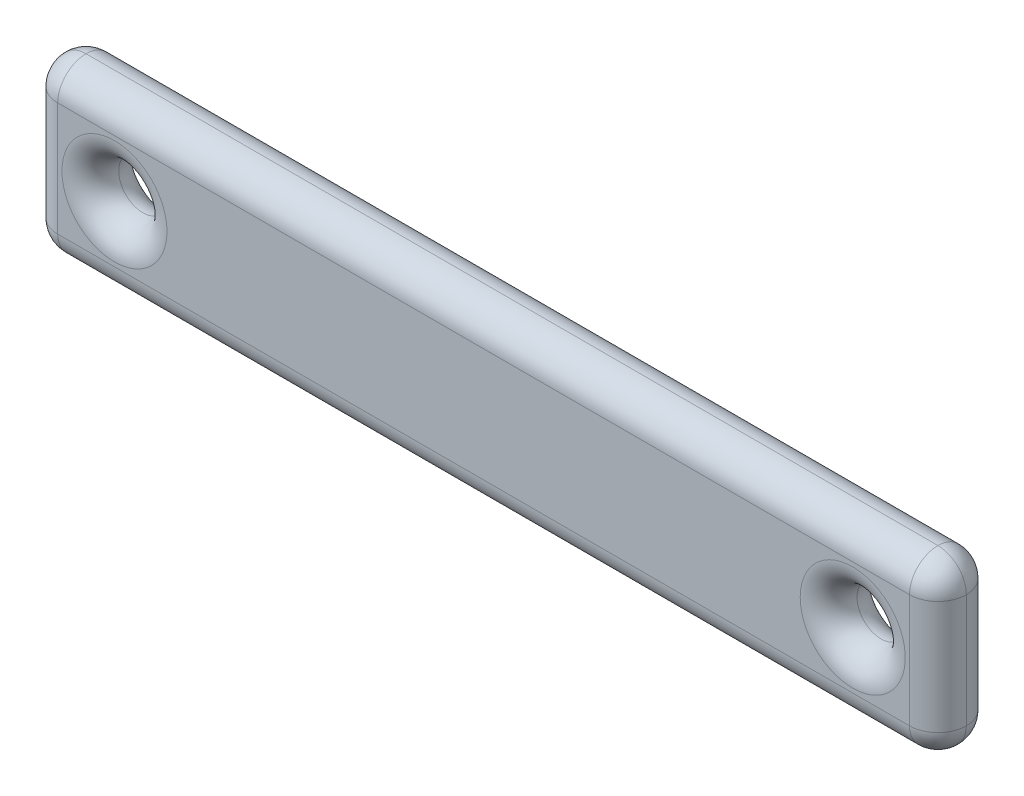
ISO-10303-21;
HEADER;
FILE_DESCRIPTION(('STEP AP214'),'2;1');
FILE_NAME('part.step','',(''),(''),'','','');
FILE_SCHEMA(('AUTOMOTIVE_DESIGN { 1 0 10303 214 1 1 1 1 }'));
ENDSEC;
DATA;
#1=APPLICATION_CONTEXT('core data for automotive mechanical design processes');
#2=APPLICATION_PROTOCOL_DEFINITION('international standard','automotive_design',2000,#1);
#3=PRODUCT_CONTEXT('',#1,'mechanical');
#4=PRODUCT('Part','Part','',(#3));
#5=PRODUCT_RELATED_PRODUCT_CATEGORY('part','',(#4));
#6=PRODUCT_DEFINITION_FORMATION('','',#4);
#7=PRODUCT_DEFINITION_CONTEXT('part definition',#1,'design');
#8=PRODUCT_DEFINITION('design','',#6,#7);
#9=PRODUCT_DEFINITION_SHAPE('','',#8);
#10=(LENGTH_UNIT() NAMED_UNIT(*) SI_UNIT(.MILLI.,.METRE.));
#11=(NAMED_UNIT(*) PLANE_ANGLE_UNIT() SI_UNIT($,.RADIAN.));
#12=(NAMED_UNIT(*) SI_UNIT($,.STERADIAN.) SOLID_ANGLE_UNIT());
#13=UNCERTAINTY_MEASURE_WITH_UNIT(LENGTH_MEASURE(1.E-05),#10,'distance_accuracy_value','');
#14=(GEOMETRIC_REPRESENTATION_CONTEXT(3) GLOBAL_UNCERTAINTY_ASSIGNED_CONTEXT((#13)) GLOBAL_UNIT_ASSIGNED_CONTEXT((#10,
#11,#12)) REPRESENTATION_CONTEXT('',''));
#15=CARTESIAN_POINT('',(0.,0.,0.));
#16=DIRECTION('',(0.,0.,1.));
#17=DIRECTION('',(1.,0.,0.));
#18=AXIS2_PLACEMENT_3D('',#15,#16,#17);
#19=CARTESIAN_POINT('',(0.,0.,2.));
#20=DIRECTION('',(0.,0.,-1.));
#21=DIRECTION('',(-1.,0.,0.));
#22=AXIS2_PLACEMENT_3D('',#19,#20,#21);
#23=PLANE('',#22);
#24=CARTESIAN_POINT('',(52.,0.,2.));
#25=DIRECTION('',(0.,0.,-1.));
#26=DIRECTION('',(-1.,0.,0.));
#27=AXIS2_PLACEMENT_3D('',#24,#25,#26);
#28=CIRCLE('',#27,3.7);
#29=CARTESIAN_POINT('',(48.3,0.,2.));
#30=VERTEX_POINT('',#29);
#31=EDGE_CURVE('E11',#30,#30,#28,.T.);
#32=ORIENTED_EDGE('',*,*,#31,.T.);
#33=EDGE_LOOP('',(#32));
#34=FACE_BOUND('',#33,.T.);
#35=CARTESIAN_POINT('',(0.,0.,2.));
#36=DIRECTION('',(0.,0.,-1.));
#37=DIRECTION('',(-1.,0.,0.));
#38=AXIS2_PLACEMENT_3D('',#35,#36,#37);
#39=CIRCLE('',#38,3.7);
#40=CARTESIAN_POINT('',(-3.7,0.,2.));
#41=VERTEX_POINT('',#40);
#42=EDGE_CURVE('E51',#41,#41,#39,.T.);
#43=ORIENTED_EDGE('',*,*,#42,.T.);
#44=EDGE_LOOP('',(#43));
#45=FACE_BOUND('',#44,.T.);
#46=DIRECTION('',(1.,0.,0.));
#47=VECTOR('',#46,1.);
#48=CARTESIAN_POINT('',(0.,-4.,2.));
#49=LINE('',#48,#47);
#50=CARTESIAN_POINT('',(-4.,-4.,2.));
#51=VERTEX_POINT('',#50);
#52=CARTESIAN_POINT('',(56.,-4.,2.));
#53=VERTEX_POINT('',#52);
#54=EDGE_CURVE('E125',#51,#53,#49,.T.);
#55=ORIENTED_EDGE('',*,*,#54,.T.);
#56=DIRECTION('',(0.,1.,0.));
#57=VECTOR('',#56,1.);
#58=CARTESIAN_POINT('',(56.,0.,2.));
#59=LINE('',#58,#57);
#60=CARTESIAN_POINT('',(56.,4.,2.));
#61=VERTEX_POINT('',#60);
#62=EDGE_CURVE('E121',#53,#61,#59,.T.);
#63=ORIENTED_EDGE('',*,*,#62,.T.);
#64=DIRECTION('',(-1.,0.,0.));
#65=VECTOR('',#64,1.);
#66=CARTESIAN_POINT('',(0.,4.,2.));
#67=LINE('',#66,#65);
#68=CARTESIAN_POINT('',(-4.,4.,2.));
#69=VERTEX_POINT('',#68);
#70=EDGE_CURVE('E150',#61,#69,#67,.T.);
#71=ORIENTED_EDGE('',*,*,#70,.T.);
#72=DIRECTION('',(0.,-1.,0.));
#73=VECTOR('',#72,1.);
#74=CARTESIAN_POINT('',(-4.,0.,2.));
#75=LINE('',#74,#73);
#76=EDGE_CURVE('E123',#69,#51,#75,.T.);
#77=ORIENTED_EDGE('',*,*,#76,.T.);
#78=EDGE_LOOP('',(#55,#63,#71,#77));
#79=FACE_BOUND('',#78,.T.);
#80=ADVANCED_FACE('F41',(#34,#45,#79),#23,.F.);
#81=CARTESIAN_POINT('',(0.,0.,-2.));
#82=DIRECTION('',(0.,0.,-1.));
#83=DIRECTION('',(-1.,0.,0.));
#84=AXIS2_PLACEMENT_3D('',#81,#82,#83);
#85=PLANE('',#84);
#86=CARTESIAN_POINT('',(52.,0.,-2.));
#87=DIRECTION('',(0.,0.,-1.));
#88=DIRECTION('',(-1.,0.,0.));
#89=AXIS2_PLACEMENT_3D('',#86,#87,#88);
#90=CIRCLE('',#89,3.7);
#91=CARTESIAN_POINT('',(48.3,0.,-2.));
#92=VERTEX_POINT('',#91);
#93=EDGE_CURVE('E129',#92,#92,#90,.F.);
#94=ORIENTED_EDGE('',*,*,#93,.T.);
#95=EDGE_LOOP('',(#94));
#96=FACE_BOUND('',#95,.T.);
#97=CARTESIAN_POINT('',(0.,0.,-2.));
#98=DIRECTION('',(0.,0.,-1.));
#99=DIRECTION('',(-1.,0.,0.));
#100=AXIS2_PLACEMENT_3D('',#97,#98,#99);
#101=CIRCLE('',#100,3.7);
#102=CARTESIAN_POINT('',(-3.7,0.,-2.));
#103=VERTEX_POINT('',#102);
#104=EDGE_CURVE('E229',#103,#103,#101,.F.);
#105=ORIENTED_EDGE('',*,*,#104,.T.);
#106=EDGE_LOOP('',(#105));
#107=FACE_BOUND('',#106,.T.);
#108=DIRECTION('',(-1.,0.,0.));
#109=VECTOR('',#108,1.);
#110=CARTESIAN_POINT('',(58.,4.,-2.));
#111=LINE('',#110,#109);
#112=CARTESIAN_POINT('',(-4.,4.,-2.));
#113=VERTEX_POINT('',#112);
#114=CARTESIAN_POINT('',(56.,4.,-2.));
#115=VERTEX_POINT('',#114);
#116=EDGE_CURVE('E219',#113,#115,#111,.F.);
#117=ORIENTED_EDGE('',*,*,#116,.T.);
#118=DIRECTION('',(0.,1.,0.));
#119=VECTOR('',#118,1.);
#120=CARTESIAN_POINT('',(56.,-6.,-2.));
#121=LINE('',#120,#119);
#122=CARTESIAN_POINT('',(56.,-4.,-2.));
#123=VERTEX_POINT('',#122);
#124=EDGE_CURVE('E221',#115,#123,#121,.F.);
#125=ORIENTED_EDGE('',*,*,#124,.T.);
#126=DIRECTION('',(1.,0.,0.));
#127=VECTOR('',#126,1.);
#128=CARTESIAN_POINT('',(-6.,-4.,-2.));
#129=LINE('',#128,#127);
#130=CARTESIAN_POINT('',(-4.,-4.,-2.));
#131=VERTEX_POINT('',#130);
#132=EDGE_CURVE('E160',#123,#131,#129,.F.);
#133=ORIENTED_EDGE('',*,*,#132,.T.);
#134=DIRECTION('',(0.,-1.,0.));
#135=VECTOR('',#134,1.);
#136=CARTESIAN_POINT('',(-4.,6.,-2.));
#137=LINE('',#136,#135);
#138=EDGE_CURVE('E223',#131,#113,#137,.F.);
#139=ORIENTED_EDGE('',*,*,#138,.T.);
#140=EDGE_LOOP('',(#117,#125,#133,#139));
#141=FACE_BOUND('',#140,.T.);
#142=ADVANCED_FACE('F240',(#96,#107,#141),#85,.T.);
#143=CARTESIAN_POINT('',(52.,0.,0.));
#144=DIRECTION('',(0.,0.,-1.));
#145=DIRECTION('',(-1.,0.,0.));
#146=AXIS2_PLACEMENT_3D('',#143,#144,#145);
#147=TOROIDAL_SURFACE('',#146,3.7,2.);
#148=ORIENTED_EDGE('',*,*,#31,.F.);
#149=EDGE_LOOP('',(#148));
#150=FACE_BOUND('',#149,.T.);
#151=CARTESIAN_POINT('',(52.,0.,0.));
#152=DIRECTION('',(0.,0.,-1.));
#153=DIRECTION('',(-1.,0.,0.));
#154=AXIS2_PLACEMENT_3D('',#151,#152,#153);
#155=CIRCLE('',#154,1.7);
#156=CARTESIAN_POINT('',(50.3,0.,0.));
#157=VERTEX_POINT('',#156);
#158=EDGE_CURVE('E152',#157,#157,#155,.F.);
#159=ORIENTED_EDGE('',*,*,#158,.F.);
#160=EDGE_LOOP('',(#159));
#161=FACE_BOUND('',#160,.T.);
#162=ADVANCED_FACE('F245',(#150,#161),#147,.T.);
#163=CARTESIAN_POINT('',(52.,0.,0.));
#164=DIRECTION('',(0.,0.,-1.));
#165=DIRECTION('',(-1.,0.,0.));
#166=AXIS2_PLACEMENT_3D('',#163,#164,#165);
#167=TOROIDAL_SURFACE('',#166,3.7,2.);
#168=ORIENTED_EDGE('',*,*,#158,.T.);
#169=EDGE_LOOP('',(#168));
#170=FACE_BOUND('',#169,.T.);
#171=ORIENTED_EDGE('',*,*,#93,.F.);
#172=EDGE_LOOP('',(#171));
#173=FACE_BOUND('',#172,.T.);
#174=ADVANCED_FACE('F238',(#170,#173),#167,.T.);
#175=CARTESIAN_POINT('',(0.,0.,0.));
#176=DIRECTION('',(0.,0.,-1.));
#177=DIRECTION('',(-1.,0.,0.));
#178=AXIS2_PLACEMENT_3D('',#175,#176,#177);
#179=TOROIDAL_SURFACE('',#178,3.7,2.);
#180=ORIENTED_EDGE('',*,*,#42,.F.);
#181=EDGE_LOOP('',(#180));
#182=FACE_BOUND('',#181,.T.);
#183=CARTESIAN_POINT('',(0.,0.,0.));
#184=DIRECTION('',(0.,0.,-1.));
#185=DIRECTION('',(-1.,0.,0.));
#186=AXIS2_PLACEMENT_3D('',#183,#184,#185);
#187=CIRCLE('',#186,1.7);
#188=CARTESIAN_POINT('',(-1.7,0.,0.));
#189=VERTEX_POINT('',#188);
#190=EDGE_CURVE('E158',#189,#189,#187,.F.);
#191=ORIENTED_EDGE('',*,*,#190,.F.);
#192=EDGE_LOOP('',(#191));
#193=FACE_BOUND('',#192,.T.);
#194=ADVANCED_FACE('F244',(#182,#193),#179,.T.);
#195=CARTESIAN_POINT('',(0.,0.,0.));
#196=DIRECTION('',(0.,0.,-1.));
#197=DIRECTION('',(-1.,0.,0.));
#198=AXIS2_PLACEMENT_3D('',#195,#196,#197);
#199=TOROIDAL_SURFACE('',#198,3.7,2.);
#200=ORIENTED_EDGE('',*,*,#190,.T.);
#201=EDGE_LOOP('',(#200));
#202=FACE_BOUND('',#201,.T.);
#203=ORIENTED_EDGE('',*,*,#104,.F.);
#204=EDGE_LOOP('',(#203));
#205=FACE_BOUND('',#204,.T.);
#206=ADVANCED_FACE('F248',(#202,#205),#199,.T.);
#207=CARTESIAN_POINT('',(-4.,0.,0.));
#208=DIRECTION('',(0.,-1.,0.));
#209=DIRECTION('',(0.,0.,-1.));
#210=AXIS2_PLACEMENT_3D('',#207,#208,#209);
#211=CYLINDRICAL_SURFACE('',#210,2.);
#212=DIRECTION('',(0.,-1.,0.));
#213=VECTOR('',#212,1.);
#214=CARTESIAN_POINT('',(-6.,-6.,0.));
#215=LINE('',#214,#213);
#216=CARTESIAN_POINT('',(-6.,-4.,0.));
#217=VERTEX_POINT('',#216);
#218=CARTESIAN_POINT('',(-6.,4.,0.));
#219=VERTEX_POINT('',#218);
#220=EDGE_CURVE('E200',#217,#219,#215,.F.);
#221=ORIENTED_EDGE('',*,*,#220,.F.);
#222=CARTESIAN_POINT('',(-4.,-4.,0.));
#223=DIRECTION('',(0.,-1.,0.));
#224=DIRECTION('',(0.,0.,-1.));
#225=AXIS2_PLACEMENT_3D('',#222,#223,#224);
#226=CIRCLE('',#225,2.);
#227=EDGE_CURVE('E44',#51,#217,#226,.T.);
#228=ORIENTED_EDGE('',*,*,#227,.F.);
#229=ORIENTED_EDGE('',*,*,#76,.F.);
#230=CARTESIAN_POINT('',(-4.,4.,0.));
#231=DIRECTION('',(0.,1.,0.));
#232=DIRECTION('',(0.,0.,1.));
#233=AXIS2_PLACEMENT_3D('',#230,#231,#232);
#234=CIRCLE('',#233,2.);
#235=EDGE_CURVE('E90',#219,#69,#234,.T.);
#236=ORIENTED_EDGE('',*,*,#235,.F.);
#237=EDGE_LOOP('',(#221,#228,#229,#236));
#238=FACE_BOUND('',#237,.T.);
#239=ADVANCED_FACE('F43',(#238),#211,.T.);
#240=CARTESIAN_POINT('',(-4.,-4.,0.));
#241=DIRECTION('',(-1.,0.,0.));
#242=DIRECTION('',(0.,0.,1.));
#243=AXIS2_PLACEMENT_3D('',#240,#241,#242);
#244=SPHERICAL_SURFACE('',#243,2.);
#245=ORIENTED_EDGE('',*,*,#227,.T.);
#246=CARTESIAN_POINT('',(-4.,-4.,0.));
#247=DIRECTION('',(0.,0.,-1.));
#248=DIRECTION('',(-1.,0.,0.));
#249=AXIS2_PLACEMENT_3D('',#246,#247,#248);
#250=CIRCLE('',#249,2.);
#251=CARTESIAN_POINT('',(-4.,-6.,0.));
#252=VERTEX_POINT('',#251);
#253=EDGE_CURVE('E96',#252,#217,#250,.T.);
#254=ORIENTED_EDGE('',*,*,#253,.F.);
#255=CARTESIAN_POINT('',(-4.,-4.,0.));
#256=DIRECTION('',(-1.,0.,0.));
#257=DIRECTION('',(0.,0.,1.));
#258=AXIS2_PLACEMENT_3D('',#255,#256,#257);
#259=CIRCLE('',#258,2.);
#260=EDGE_CURVE('E191',#51,#252,#259,.F.);
#261=ORIENTED_EDGE('',*,*,#260,.F.);
#262=EDGE_LOOP('',(#245,#254,#261));
#263=FACE_BOUND('',#262,.T.);
#264=ADVANCED_FACE('F208',(#263),#244,.T.);
#265=CARTESIAN_POINT('',(-4.,4.,0.));
#266=DIRECTION('',(-1.,0.,0.));
#267=DIRECTION('',(0.,0.,1.));
#268=AXIS2_PLACEMENT_3D('',#265,#266,#267);
#269=SPHERICAL_SURFACE('',#268,2.);
#270=CARTESIAN_POINT('',(-4.,4.,0.));
#271=DIRECTION('',(0.,0.,1.));
#272=DIRECTION('',(1.,0.,0.));
#273=AXIS2_PLACEMENT_3D('',#270,#271,#272);
#274=CIRCLE('',#273,2.);
#275=CARTESIAN_POINT('',(-4.,6.,0.));
#276=VERTEX_POINT('',#275);
#277=EDGE_CURVE('E205',#219,#276,#274,.F.);
#278=ORIENTED_EDGE('',*,*,#277,.F.);
#279=ORIENTED_EDGE('',*,*,#235,.T.);
#280=CARTESIAN_POINT('',(-4.,4.,0.));
#281=DIRECTION('',(-1.,0.,0.));
#282=DIRECTION('',(0.,0.,1.));
#283=AXIS2_PLACEMENT_3D('',#280,#281,#282);
#284=CIRCLE('',#283,2.);
#285=EDGE_CURVE('E192',#276,#69,#284,.F.);
#286=ORIENTED_EDGE('',*,*,#285,.F.);
#287=EDGE_LOOP('',(#278,#279,#286));
#288=FACE_BOUND('',#287,.T.);
#289=ADVANCED_FACE('F314',(#288),#269,.T.);
#290=CARTESIAN_POINT('',(-4.,-6.,0.));
#291=DIRECTION('',(0.,1.,0.));
#292=DIRECTION('',(0.,0.,1.));
#293=AXIS2_PLACEMENT_3D('',#290,#291,#292);
#294=CYLINDRICAL_SURFACE('',#293,2.);
#295=CARTESIAN_POINT('',(-4.,-4.,0.));
#296=DIRECTION('',(0.,-1.,0.));
#297=DIRECTION('',(0.,0.,-1.));
#298=AXIS2_PLACEMENT_3D('',#295,#296,#297);
#299=CIRCLE('',#298,2.);
#300=EDGE_CURVE('E197',#217,#131,#299,.T.);
#301=ORIENTED_EDGE('',*,*,#300,.F.);
#302=ORIENTED_EDGE('',*,*,#220,.T.);
#303=CARTESIAN_POINT('',(-4.,4.,0.));
#304=DIRECTION('',(0.,1.,0.));
#305=DIRECTION('',(0.,0.,1.));
#306=AXIS2_PLACEMENT_3D('',#303,#304,#305);
#307=CIRCLE('',#306,2.);
#308=EDGE_CURVE('E190',#113,#219,#307,.T.);
#309=ORIENTED_EDGE('',*,*,#308,.F.);
#310=ORIENTED_EDGE('',*,*,#138,.F.);
#311=EDGE_LOOP('',(#301,#302,#309,#310));
#312=FACE_BOUND('',#311,.T.);
#313=ADVANCED_FACE('F211',(#312),#294,.T.);
#314=CARTESIAN_POINT('',(-4.,-4.,0.));
#315=DIRECTION('',(-1.,0.,0.));
#316=DIRECTION('',(0.,0.,1.));
#317=AXIS2_PLACEMENT_3D('',#314,#315,#316);
#318=SPHERICAL_SURFACE('',#317,2.);
#319=ORIENTED_EDGE('',*,*,#253,.T.);
#320=ORIENTED_EDGE('',*,*,#300,.T.);
#321=CARTESIAN_POINT('',(-4.,-4.,0.));
#322=DIRECTION('',(-1.,0.,0.));
#323=DIRECTION('',(0.,0.,1.));
#324=AXIS2_PLACEMENT_3D('',#321,#322,#323);
#325=CIRCLE('',#324,2.);
#326=EDGE_CURVE('E183',#252,#131,#325,.F.);
#327=ORIENTED_EDGE('',*,*,#326,.F.);
#328=EDGE_LOOP('',(#319,#320,#327));
#329=FACE_BOUND('',#328,.T.);
#330=ADVANCED_FACE('F310',(#329),#318,.T.);
#331=CARTESIAN_POINT('',(0.,-4.,0.));
#332=DIRECTION('',(1.,0.,0.));
#333=DIRECTION('',(0.,0.,-1.));
#334=AXIS2_PLACEMENT_3D('',#331,#332,#333);
#335=CYLINDRICAL_SURFACE('',#334,2.);
#336=ORIENTED_EDGE('',*,*,#54,.F.);
#337=ORIENTED_EDGE('',*,*,#260,.T.);
#338=DIRECTION('',(1.,0.,0.));
#339=VECTOR('',#338,1.);
#340=CARTESIAN_POINT('',(-6.,-6.,0.));
#341=LINE('',#340,#339);
#342=CARTESIAN_POINT('',(56.,-6.,0.));
#343=VERTEX_POINT('',#342);
#344=EDGE_CURVE('E137',#343,#252,#341,.F.);
#345=ORIENTED_EDGE('',*,*,#344,.F.);
#346=CARTESIAN_POINT('',(56.,-4.,0.));
#347=DIRECTION('',(1.,0.,0.));
#348=DIRECTION('',(0.,0.,-1.));
#349=AXIS2_PLACEMENT_3D('',#346,#347,#348);
#350=CIRCLE('',#349,2.);
#351=EDGE_CURVE('E134',#53,#343,#350,.T.);
#352=ORIENTED_EDGE('',*,*,#351,.F.);
#353=EDGE_LOOP('',(#336,#337,#345,#352));
#354=FACE_BOUND('',#353,.T.);
#355=ADVANCED_FACE('F131',(#354),#335,.T.);
#356=CARTESIAN_POINT('',(0.,4.,0.));
#357=DIRECTION('',(-1.,0.,0.));
#358=DIRECTION('',(0.,0.,1.));
#359=AXIS2_PLACEMENT_3D('',#356,#357,#358);
#360=CYLINDRICAL_SURFACE('',#359,2.);
#361=ORIENTED_EDGE('',*,*,#285,.T.);
#362=ORIENTED_EDGE('',*,*,#70,.F.);
#363=CARTESIAN_POINT('',(56.,4.,0.));
#364=DIRECTION('',(1.,0.,0.));
#365=DIRECTION('',(0.,0.,-1.));
#366=AXIS2_PLACEMENT_3D('',#363,#364,#365);
#367=CIRCLE('',#366,2.);
#368=CARTESIAN_POINT('',(56.,6.,0.));
#369=VERTEX_POINT('',#368);
#370=EDGE_CURVE('E136',#369,#61,#367,.T.);
#371=ORIENTED_EDGE('',*,*,#370,.F.);
#372=DIRECTION('',(-1.,0.,0.));
#373=VECTOR('',#372,1.);
#374=CARTESIAN_POINT('',(-6.,6.,0.));
#375=LINE('',#374,#373);
#376=EDGE_CURVE('E180',#276,#369,#375,.F.);
#377=ORIENTED_EDGE('',*,*,#376,.F.);
#378=EDGE_LOOP('',(#361,#362,#371,#377));
#379=FACE_BOUND('',#378,.T.);
#380=ADVANCED_FACE('F304',(#379),#360,.T.);
#381=CARTESIAN_POINT('',(-4.,4.,0.));
#382=DIRECTION('',(-1.,0.,0.));
#383=DIRECTION('',(0.,0.,1.));
#384=AXIS2_PLACEMENT_3D('',#381,#382,#383);
#385=SPHERICAL_SURFACE('',#384,2.);
#386=ORIENTED_EDGE('',*,*,#308,.T.);
#387=ORIENTED_EDGE('',*,*,#277,.T.);
#388=CARTESIAN_POINT('',(-4.,4.,0.));
#389=DIRECTION('',(-1.,0.,0.));
#390=DIRECTION('',(0.,0.,1.));
#391=AXIS2_PLACEMENT_3D('',#388,#389,#390);
#392=CIRCLE('',#391,2.);
#393=EDGE_CURVE('E171',#113,#276,#392,.F.);
#394=ORIENTED_EDGE('',*,*,#393,.F.);
#395=EDGE_LOOP('',(#386,#387,#394));
#396=FACE_BOUND('',#395,.T.);
#397=ADVANCED_FACE('F214',(#396),#385,.T.);
#398=CARTESIAN_POINT('',(-6.,-4.,0.));
#399=DIRECTION('',(-1.,0.,0.));
#400=DIRECTION('',(0.,0.,1.));
#401=AXIS2_PLACEMENT_3D('',#398,#399,#400);
#402=CYLINDRICAL_SURFACE('',#401,2.);
#403=CARTESIAN_POINT('',(56.,-4.,0.));
#404=DIRECTION('',(1.,0.,0.));
#405=DIRECTION('',(0.,0.,-1.));
#406=AXIS2_PLACEMENT_3D('',#403,#404,#405);
#407=CIRCLE('',#406,2.);
#408=EDGE_CURVE('E174',#343,#123,#407,.T.);
#409=ORIENTED_EDGE('',*,*,#408,.F.);
#410=ORIENTED_EDGE('',*,*,#344,.T.);
#411=ORIENTED_EDGE('',*,*,#326,.T.);
#412=ORIENTED_EDGE('',*,*,#132,.F.);
#413=EDGE_LOOP('',(#409,#410,#411,#412));
#414=FACE_BOUND('',#413,.T.);
#415=ADVANCED_FACE('F299',(#414),#402,.T.);
#416=CARTESIAN_POINT('',(56.,-4.,0.));
#417=DIRECTION('',(0.,-1.,0.));
#418=DIRECTION('',(0.,0.,-1.));
#419=AXIS2_PLACEMENT_3D('',#416,#417,#418);
#420=SPHERICAL_SURFACE('',#419,2.);
#421=ORIENTED_EDGE('',*,*,#351,.T.);
#422=CARTESIAN_POINT('',(56.,-4.,0.));
#423=DIRECTION('',(0.,0.,-1.));
#424=DIRECTION('',(-1.,0.,0.));
#425=AXIS2_PLACEMENT_3D('',#422,#423,#424);
#426=CIRCLE('',#425,2.);
#427=CARTESIAN_POINT('',(58.,-4.,0.));
#428=VERTEX_POINT('',#427);
#429=EDGE_CURVE('E145',#428,#343,#426,.T.);
#430=ORIENTED_EDGE('',*,*,#429,.F.);
#431=CARTESIAN_POINT('',(56.,-4.,0.));
#432=DIRECTION('',(0.,-1.,0.));
#433=DIRECTION('',(0.,0.,-1.));
#434=AXIS2_PLACEMENT_3D('',#431,#432,#433);
#435=CIRCLE('',#434,2.);
#436=EDGE_CURVE('E142',#53,#428,#435,.F.);
#437=ORIENTED_EDGE('',*,*,#436,.F.);
#438=EDGE_LOOP('',(#421,#430,#437));
#439=FACE_BOUND('',#438,.T.);
#440=ADVANCED_FACE('F141',(#439),#420,.T.);
#441=CARTESIAN_POINT('',(56.,4.,0.));
#442=DIRECTION('',(0.,1.,0.));
#443=DIRECTION('',(0.,0.,1.));
#444=AXIS2_PLACEMENT_3D('',#441,#442,#443);
#445=SPHERICAL_SURFACE('',#444,2.);
#446=CARTESIAN_POINT('',(56.,4.,0.));
#447=DIRECTION('',(0.,0.,1.));
#448=DIRECTION('',(1.,0.,0.));
#449=AXIS2_PLACEMENT_3D('',#446,#447,#448);
#450=CIRCLE('',#449,2.);
#451=CARTESIAN_POINT('',(58.,4.,0.));
#452=VERTEX_POINT('',#451);
#453=EDGE_CURVE('E178',#369,#452,#450,.F.);
#454=ORIENTED_EDGE('',*,*,#453,.F.);
#455=ORIENTED_EDGE('',*,*,#370,.T.);
#456=CARTESIAN_POINT('',(56.,4.,0.));
#457=DIRECTION('',(0.,1.,0.));
#458=DIRECTION('',(0.,0.,1.));
#459=AXIS2_PLACEMENT_3D('',#456,#457,#458);
#460=CIRCLE('',#459,2.);
#461=EDGE_CURVE('E58',#452,#61,#460,.F.);
#462=ORIENTED_EDGE('',*,*,#461,.F.);
#463=EDGE_LOOP('',(#454,#455,#462));
#464=FACE_BOUND('',#463,.T.);
#465=ADVANCED_FACE('F292',(#464),#445,.T.);
#466=CARTESIAN_POINT('',(-6.,4.,0.));
#467=DIRECTION('',(1.,0.,0.));
#468=DIRECTION('',(0.,0.,-1.));
#469=AXIS2_PLACEMENT_3D('',#466,#467,#468);
#470=CYLINDRICAL_SURFACE('',#469,2.);
#471=ORIENTED_EDGE('',*,*,#393,.T.);
#472=ORIENTED_EDGE('',*,*,#376,.T.);
#473=CARTESIAN_POINT('',(56.,4.,0.));
#474=DIRECTION('',(1.,0.,0.));
#475=DIRECTION('',(0.,0.,-1.));
#476=AXIS2_PLACEMENT_3D('',#473,#474,#475);
#477=CIRCLE('',#476,2.);
#478=EDGE_CURVE('E170',#115,#369,#477,.T.);
#479=ORIENTED_EDGE('',*,*,#478,.F.);
#480=ORIENTED_EDGE('',*,*,#116,.F.);
#481=EDGE_LOOP('',(#471,#472,#479,#480));
#482=FACE_BOUND('',#481,.T.);
#483=ADVANCED_FACE('F222',(#482),#470,.T.);
#484=CARTESIAN_POINT('',(56.,-4.,0.));
#485=DIRECTION('',(0.,-1.,0.));
#486=DIRECTION('',(0.,0.,-1.));
#487=AXIS2_PLACEMENT_3D('',#484,#485,#486);
#488=SPHERICAL_SURFACE('',#487,2.);
#489=ORIENTED_EDGE('',*,*,#429,.T.);
#490=ORIENTED_EDGE('',*,*,#408,.T.);
#491=CARTESIAN_POINT('',(56.,-4.,0.));
#492=DIRECTION('',(0.,-1.,0.));
#493=DIRECTION('',(0.,0.,-1.));
#494=AXIS2_PLACEMENT_3D('',#491,#492,#493);
#495=CIRCLE('',#494,2.);
#496=EDGE_CURVE('E104',#428,#123,#495,.F.);
#497=ORIENTED_EDGE('',*,*,#496,.F.);
#498=EDGE_LOOP('',(#489,#490,#497));
#499=FACE_BOUND('',#498,.T.);
#500=ADVANCED_FACE('F283',(#499),#488,.T.);
#501=CARTESIAN_POINT('',(56.,0.,0.));
#502=DIRECTION('',(0.,1.,0.));
#503=DIRECTION('',(0.,0.,1.));
#504=AXIS2_PLACEMENT_3D('',#501,#502,#503);
#505=CYLINDRICAL_SURFACE('',#504,2.);
#506=ORIENTED_EDGE('',*,*,#62,.F.);
#507=ORIENTED_EDGE('',*,*,#436,.T.);
#508=DIRECTION('',(0.,1.,0.));
#509=VECTOR('',#508,1.);
#510=CARTESIAN_POINT('',(58.,-6.,0.));
#511=LINE('',#510,#509);
#512=EDGE_CURVE('E163',#452,#428,#511,.F.);
#513=ORIENTED_EDGE('',*,*,#512,.F.);
#514=ORIENTED_EDGE('',*,*,#461,.T.);
#515=EDGE_LOOP('',(#506,#507,#513,#514));
#516=FACE_BOUND('',#515,.T.);
#517=ADVANCED_FACE('F148',(#516),#505,.T.);
#518=CARTESIAN_POINT('',(56.,4.,0.));
#519=DIRECTION('',(0.,1.,0.));
#520=DIRECTION('',(0.,0.,1.));
#521=AXIS2_PLACEMENT_3D('',#518,#519,#520);
#522=SPHERICAL_SURFACE('',#521,2.);
#523=ORIENTED_EDGE('',*,*,#478,.T.);
#524=ORIENTED_EDGE('',*,*,#453,.T.);
#525=CARTESIAN_POINT('',(56.,4.,0.));
#526=DIRECTION('',(0.,1.,0.));
#527=DIRECTION('',(0.,0.,1.));
#528=AXIS2_PLACEMENT_3D('',#525,#526,#527);
#529=CIRCLE('',#528,2.);
#530=EDGE_CURVE('E161',#115,#452,#529,.F.);
#531=ORIENTED_EDGE('',*,*,#530,.F.);
#532=EDGE_LOOP('',(#523,#524,#531));
#533=FACE_BOUND('',#532,.T.);
#534=ADVANCED_FACE('F276',(#533),#522,.T.);
#535=CARTESIAN_POINT('',(56.,-6.,0.));
#536=DIRECTION('',(0.,-1.,0.));
#537=DIRECTION('',(0.,0.,-1.));
#538=AXIS2_PLACEMENT_3D('',#535,#536,#537);
#539=CYLINDRICAL_SURFACE('',#538,2.);
#540=ORIENTED_EDGE('',*,*,#496,.T.);
#541=ORIENTED_EDGE('',*,*,#124,.F.);
#542=ORIENTED_EDGE('',*,*,#530,.T.);
#543=ORIENTED_EDGE('',*,*,#512,.T.);
#544=EDGE_LOOP('',(#540,#541,#542,#543));
#545=FACE_BOUND('',#544,.T.);
#546=ADVANCED_FACE('F277',(#545),#539,.T.);
#547=CLOSED_SHELL('',(#80,#142,#162,#174,#194,#206,#239,#264,#289,#313,#330,#355,#380,#397,#415,
#440,#465,#483,#500,#517,#534,#546));
#548=MANIFOLD_SOLID_BREP('B2',#547);
#549=ADVANCED_BREP_SHAPE_REPRESENTATION('',(#18,#548),#14);
#550=SHAPE_DEFINITION_REPRESENTATION(#9,#549);
ENDSEC;
END-ISO-10303-21;
